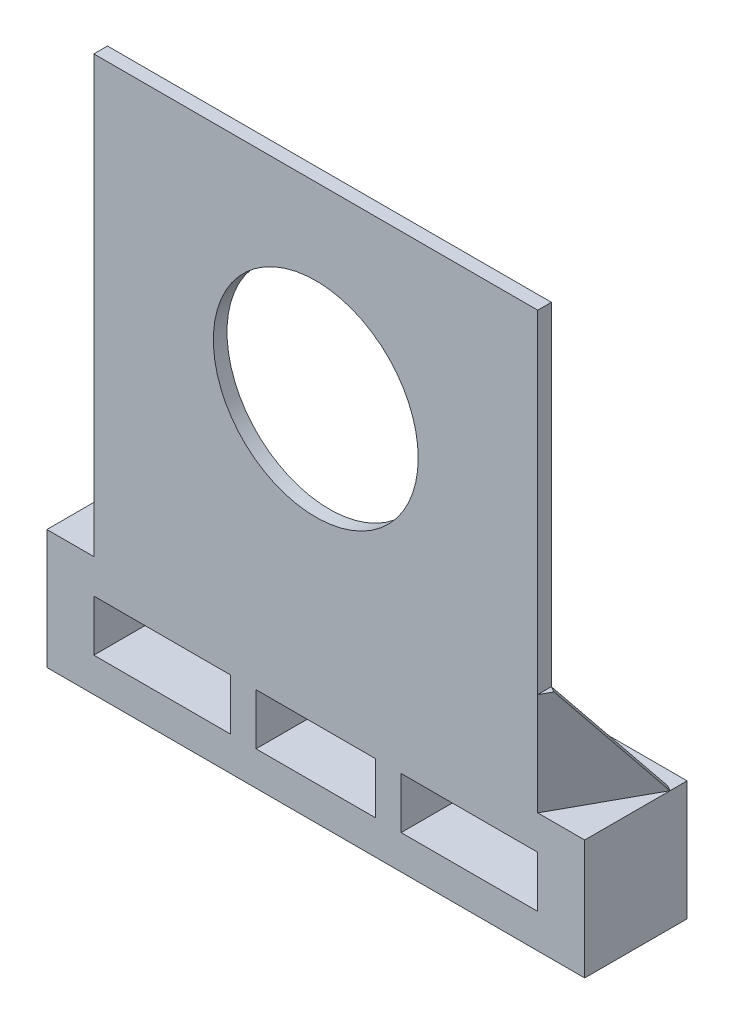
ISO-10303-21;
HEADER;
FILE_DESCRIPTION(('STEP AP214'),'2;1');
FILE_NAME('part.step','',(''),(''),'','','');
FILE_SCHEMA(('AUTOMOTIVE_DESIGN { 1 0 10303 214 1 1 1 1 }'));
ENDSEC;
DATA;
#1=APPLICATION_CONTEXT('core data for automotive mechanical design processes');
#2=APPLICATION_PROTOCOL_DEFINITION('international standard','automotive_design',2000,#1);
#3=PRODUCT_CONTEXT('',#1,'mechanical');
#4=PRODUCT('Part','Part','',(#3));
#5=PRODUCT_RELATED_PRODUCT_CATEGORY('part','',(#4));
#6=PRODUCT_DEFINITION_FORMATION('','',#4);
#7=PRODUCT_DEFINITION_CONTEXT('part definition',#1,'design');
#8=PRODUCT_DEFINITION('design','',#6,#7);
#9=PRODUCT_DEFINITION_SHAPE('','',#8);
#10=(LENGTH_UNIT() NAMED_UNIT(*) SI_UNIT(.MILLI.,.METRE.));
#11=(NAMED_UNIT(*) PLANE_ANGLE_UNIT() SI_UNIT($,.RADIAN.));
#12=(NAMED_UNIT(*) SI_UNIT($,.STERADIAN.) SOLID_ANGLE_UNIT());
#13=UNCERTAINTY_MEASURE_WITH_UNIT(LENGTH_MEASURE(1.E-05),#10,'distance_accuracy_value','');
#14=(GEOMETRIC_REPRESENTATION_CONTEXT(3) GLOBAL_UNCERTAINTY_ASSIGNED_CONTEXT((#13)) GLOBAL_UNIT_ASSIGNED_CONTEXT((#10,
#11,#12)) REPRESENTATION_CONTEXT('',''));
#15=CARTESIAN_POINT('',(0.,0.,0.));
#16=DIRECTION('',(0.,0.,1.));
#17=DIRECTION('',(1.,0.,0.));
#18=AXIS2_PLACEMENT_3D('',#15,#16,#17);
#19=CARTESIAN_POINT('',(-130.,-67.5,-8.));
#20=DIRECTION('',(0.876215908676646,0.,-0.481918749772157));
#21=DIRECTION('',(-0.481918749772158,0.,-0.876215908676646));
#22=AXIS2_PLACEMENT_3D('',#19,#20,#21);
#23=PLANE('',#22);
#24=DIRECTION('',(0.481918749772157,0.,0.876215908676646));
#25=VECTOR('',#24,1.);
#26=CARTESIAN_POINT('',(-130.,-127.5,-8.));
#27=LINE('',#26,#25);
#28=CARTESIAN_POINT('',(-154.121880998081,-127.5,-51.8579654510556));
#29=VERTEX_POINT('',#28);
#30=CARTESIAN_POINT('',(-130.,-127.5,-8.));
#31=VERTEX_POINT('',#30);
#32=EDGE_CURVE('E466',#29,#31,#27,.T.);
#33=ORIENTED_EDGE('',*,*,#32,.F.);
#34=DIRECTION('',(0.308712772093157,0.767882335837045,0.561295949260283));
#35=VECTOR('',#34,1.);
#36=CARTESIAN_POINT('',(-130.,-67.5,-8.));
#37=LINE('',#36,#35);
#38=CARTESIAN_POINT('',(-130.,-67.5,-7.99999999999998));
#39=VERTEX_POINT('',#38);
#40=EDGE_CURVE('E477',#29,#39,#37,.T.);
#41=ORIENTED_EDGE('',*,*,#40,.T.);
#42=DIRECTION('',(0.,-1.,0.));
#43=VECTOR('',#42,1.);
#44=CARTESIAN_POINT('',(-130.,-67.5,-8.));
#45=LINE('',#44,#43);
#46=EDGE_CURVE('E99',#39,#31,#45,.T.);
#47=ORIENTED_EDGE('',*,*,#46,.T.);
#48=EDGE_LOOP('',(#33,#41,#47));
#49=FACE_BOUND('',#48,.T.);
#50=ADVANCED_FACE('F33',(#49),#23,.T.);
#51=CARTESIAN_POINT('',(-130.,-67.5,0.));
#52=DIRECTION('',(-0.876215908676646,0.,0.481918749772157));
#53=DIRECTION('',(0.481918749772157,0.,0.876215908676647));
#54=AXIS2_PLACEMENT_3D('',#51,#52,#53);
#55=PLANE('',#54);
#56=DIRECTION('',(-0.481918749772157,0.,-0.876215908676646));
#57=VECTOR('',#56,1.);
#58=CARTESIAN_POINT('',(-130.,-67.5,0.));
#59=LINE('',#58,#57);
#60=CARTESIAN_POINT('',(-130.,-67.5,0.));
#61=VERTEX_POINT('',#60);
#62=CARTESIAN_POINT('',(-133.378119001919,-67.5,-6.14203454894435));
#63=VERTEX_POINT('',#62);
#64=EDGE_CURVE('E100',#61,#63,#59,.T.);
#65=ORIENTED_EDGE('',*,*,#64,.T.);
#66=DIRECTION('',(-0.308712772093157,-0.767882335837044,-0.561295949260283));
#67=VECTOR('',#66,1.);
#68=CARTESIAN_POINT('',(-133.378119001919,-67.5,-6.14203454894428));
#69=LINE('',#68,#67);
#70=CARTESIAN_POINT('',(-157.5,-127.5,-49.9999999999999));
#71=VERTEX_POINT('',#70);
#72=EDGE_CURVE('E47',#63,#71,#69,.T.);
#73=ORIENTED_EDGE('',*,*,#72,.T.);
#74=DIRECTION('',(-0.481918749772157,0.,-0.876215908676646));
#75=VECTOR('',#74,1.);
#76=CARTESIAN_POINT('',(-130.,-127.5,0.));
#77=LINE('',#76,#75);
#78=CARTESIAN_POINT('',(-130.,-127.5,0.));
#79=VERTEX_POINT('',#78);
#80=EDGE_CURVE('E72',#79,#71,#77,.T.);
#81=ORIENTED_EDGE('',*,*,#80,.F.);
#82=DIRECTION('',(0.,-1.,0.));
#83=VECTOR('',#82,1.);
#84=CARTESIAN_POINT('',(-130.,-67.5,0.));
#85=LINE('',#84,#83);
#86=EDGE_CURVE('E77',#61,#79,#85,.T.);
#87=ORIENTED_EDGE('',*,*,#86,.F.);
#88=EDGE_LOOP('',(#65,#73,#81,#87));
#89=FACE_BOUND('',#88,.T.);
#90=ADVANCED_FACE('F75',(#89),#55,.T.);
#91=CARTESIAN_POINT('',(0.,-67.4999999999999,0.));
#92=DIRECTION('',(0.,-1.,0.));
#93=DIRECTION('',(0.,0.,-1.));
#94=AXIS2_PLACEMENT_3D('',#91,#92,#93);
#95=PLANE('',#94);
#96=DIRECTION('',(0.876215908676646,0.,-0.481918749772157));
#97=VECTOR('',#96,1.);
#98=CARTESIAN_POINT('',(-33.570057581574,-67.4999999999999,-61.0364683301344));
#99=LINE('',#98,#97);
#100=EDGE_CURVE('E11',#63,#39,#99,.T.);
#101=ORIENTED_EDGE('',*,*,#100,.F.);
#102=ORIENTED_EDGE('',*,*,#64,.F.);
#103=DIRECTION('',(0.,0.,1.));
#104=VECTOR('',#103,1.);
#105=CARTESIAN_POINT('',(-130.,-67.5,0.));
#106=LINE('',#105,#104);
#107=EDGE_CURVE('E84',#39,#61,#106,.T.);
#108=ORIENTED_EDGE('',*,*,#107,.F.);
#109=EDGE_LOOP('',(#101,#102,#108));
#110=FACE_BOUND('',#109,.T.);
#111=ADVANCED_FACE('F483',(#110),#95,.F.);
#112=CARTESIAN_POINT('',(-157.5,-127.5,-60.));
#113=DIRECTION('',(0.,1.,0.));
#114=DIRECTION('',(0.,0.,1.));
#115=AXIS2_PLACEMENT_3D('',#112,#113,#114);
#116=PLANE('',#115);
#117=DIRECTION('',(-1.,0.,0.));
#118=VECTOR('',#117,1.);
#119=CARTESIAN_POINT('',(-157.5,-127.5,-60.));
#120=LINE('',#119,#118);
#121=CARTESIAN_POINT('',(157.5,-127.5,-60.));
#122=VERTEX_POINT('',#121);
#123=CARTESIAN_POINT('',(-157.5,-127.5,-60.));
#124=VERTEX_POINT('',#123);
#125=EDGE_CURVE('E336',#122,#124,#120,.T.);
#126=ORIENTED_EDGE('',*,*,#125,.T.);
#127=DIRECTION('',(0.,0.,1.));
#128=VECTOR('',#127,1.);
#129=CARTESIAN_POINT('',(-157.5,-127.5,-60.));
#130=LINE('',#129,#128);
#131=EDGE_CURVE('E126',#124,#71,#130,.T.);
#132=ORIENTED_EDGE('',*,*,#131,.T.);
#133=DIRECTION('',(0.876215908676647,0.,-0.481918749772156));
#134=VECTOR('',#133,1.);
#135=CARTESIAN_POINT('',(-154.121880998081,-127.5,-51.8579654510557));
#136=LINE('',#135,#134);
#137=EDGE_CURVE('E85',#71,#29,#136,.T.);
#138=ORIENTED_EDGE('',*,*,#137,.T.);
#139=ORIENTED_EDGE('',*,*,#32,.T.);
#140=DIRECTION('',(1.,0.,0.));
#141=VECTOR('',#140,1.);
#142=CARTESIAN_POINT('',(-130.,-127.5,-8.));
#143=LINE('',#142,#141);
#144=CARTESIAN_POINT('',(130.,-127.5,-8.));
#145=VERTEX_POINT('',#144);
#146=EDGE_CURVE('E148',#31,#145,#143,.T.);
#147=ORIENTED_EDGE('',*,*,#146,.T.);
#148=DIRECTION('',(-0.481918749772157,0.,0.876215908676646));
#149=VECTOR('',#148,1.);
#150=CARTESIAN_POINT('',(130.,-127.5,-8.));
#151=LINE('',#150,#149);
#152=CARTESIAN_POINT('',(154.121880998081,-127.5,-51.8579654510556));
#153=VERTEX_POINT('',#152);
#154=EDGE_CURVE('E188',#153,#145,#151,.T.);
#155=ORIENTED_EDGE('',*,*,#154,.F.);
#156=DIRECTION('',(-0.876215908676647,0.,-0.481918749772156));
#157=VECTOR('',#156,1.);
#158=CARTESIAN_POINT('',(154.121880998081,-127.5,-51.8579654510557));
#159=LINE('',#158,#157);
#160=CARTESIAN_POINT('',(157.5,-127.5,-49.9999999999999));
#161=VERTEX_POINT('',#160);
#162=EDGE_CURVE('E218',#161,#153,#159,.T.);
#163=ORIENTED_EDGE('',*,*,#162,.F.);
#164=DIRECTION('',(0.,0.,1.));
#165=VECTOR('',#164,1.);
#166=CARTESIAN_POINT('',(157.5,-127.5,-60.));
#167=LINE('',#166,#165);
#168=EDGE_CURVE('E129',#122,#161,#167,.T.);
#169=ORIENTED_EDGE('',*,*,#168,.F.);
#170=EDGE_LOOP('',(#126,#132,#138,#139,#147,#155,#163,#169));
#171=FACE_BOUND('',#170,.T.);
#172=ADVANCED_FACE('F445',(#171),#116,.T.);
#173=CARTESIAN_POINT('',(-130.,127.5,-8.));
#174=DIRECTION('',(-1.,0.,0.));
#175=DIRECTION('',(0.,-1.,0.));
#176=AXIS2_PLACEMENT_3D('',#173,#174,#175);
#177=PLANE('',#176);
#178=DIRECTION('',(0.,-1.,0.));
#179=VECTOR('',#178,1.);
#180=CARTESIAN_POINT('',(-130.,127.5,-8.));
#181=LINE('',#180,#179);
#182=CARTESIAN_POINT('',(-130.,127.5,-8.));
#183=VERTEX_POINT('',#182);
#184=EDGE_CURVE('E146',#183,#39,#181,.T.);
#185=ORIENTED_EDGE('',*,*,#184,.T.);
#186=ORIENTED_EDGE('',*,*,#107,.T.);
#187=DIRECTION('',(0.,-1.,0.));
#188=VECTOR('',#187,1.);
#189=CARTESIAN_POINT('',(-130.,127.5,0.));
#190=LINE('',#189,#188);
#191=CARTESIAN_POINT('',(-130.,127.5,0.));
#192=VERTEX_POINT('',#191);
#193=EDGE_CURVE('E98',#192,#61,#190,.T.);
#194=ORIENTED_EDGE('',*,*,#193,.F.);
#195=DIRECTION('',(0.,0.,1.));
#196=VECTOR('',#195,1.);
#197=CARTESIAN_POINT('',(-130.,127.5,-8.));
#198=LINE('',#197,#196);
#199=EDGE_CURVE('E56',#183,#192,#198,.T.);
#200=ORIENTED_EDGE('',*,*,#199,.F.);
#201=EDGE_LOOP('',(#185,#186,#194,#200));
#202=FACE_BOUND('',#201,.T.);
#203=ADVANCED_FACE('F471',(#202),#177,.T.);
#204=CARTESIAN_POINT('',(130.,127.5,-8.));
#205=DIRECTION('',(1.,0.,0.));
#206=DIRECTION('',(0.,1.,0.));
#207=AXIS2_PLACEMENT_3D('',#204,#205,#206);
#208=PLANE('',#207);
#209=DIRECTION('',(0.,1.,0.));
#210=VECTOR('',#209,1.);
#211=CARTESIAN_POINT('',(130.,127.5,0.));
#212=LINE('',#211,#210);
#213=CARTESIAN_POINT('',(130.,-67.5,0.));
#214=VERTEX_POINT('',#213);
#215=CARTESIAN_POINT('',(130.,127.5,0.));
#216=VERTEX_POINT('',#215);
#217=EDGE_CURVE('E136',#214,#216,#212,.T.);
#218=ORIENTED_EDGE('',*,*,#217,.F.);
#219=DIRECTION('',(0.,0.,1.));
#220=VECTOR('',#219,1.);
#221=CARTESIAN_POINT('',(130.,-67.5,0.));
#222=LINE('',#221,#220);
#223=CARTESIAN_POINT('',(130.,-67.5,-8.));
#224=VERTEX_POINT('',#223);
#225=EDGE_CURVE('E168',#224,#214,#222,.T.);
#226=ORIENTED_EDGE('',*,*,#225,.F.);
#227=DIRECTION('',(0.,1.,0.));
#228=VECTOR('',#227,1.);
#229=CARTESIAN_POINT('',(130.,127.5,-8.));
#230=LINE('',#229,#228);
#231=CARTESIAN_POINT('',(130.,127.5,-8.));
#232=VERTEX_POINT('',#231);
#233=EDGE_CURVE('E143',#224,#232,#230,.T.);
#234=ORIENTED_EDGE('',*,*,#233,.T.);
#235=DIRECTION('',(0.,0.,1.));
#236=VECTOR('',#235,1.);
#237=CARTESIAN_POINT('',(130.,127.5,-8.));
#238=LINE('',#237,#236);
#239=EDGE_CURVE('E151',#232,#216,#238,.T.);
#240=ORIENTED_EDGE('',*,*,#239,.T.);
#241=EDGE_LOOP('',(#218,#226,#234,#240));
#242=FACE_BOUND('',#241,.T.);
#243=ADVANCED_FACE('F35',(#242),#208,.T.);
#244=CARTESIAN_POINT('',(157.5,-127.5,0.));
#245=VERTEX_POINT('',#244);
#246=EDGE_CURVE('E132',#161,#245,#167,.T.);
#247=ORIENTED_EDGE('',*,*,#246,.F.);
#248=DIRECTION('',(0.481918749772157,0.,-0.876215908676646));
#249=VECTOR('',#248,1.);
#250=CARTESIAN_POINT('',(130.,-127.5,0.));
#251=LINE('',#250,#249);
#252=CARTESIAN_POINT('',(130.,-127.5,0.));
#253=VERTEX_POINT('',#252);
#254=EDGE_CURVE('E210',#253,#161,#251,.T.);
#255=ORIENTED_EDGE('',*,*,#254,.F.);
#256=DIRECTION('',(-1.,0.,0.));
#257=VECTOR('',#256,1.);
#258=CARTESIAN_POINT('',(-157.5,-127.5,0.));
#259=LINE('',#258,#257);
#260=EDGE_CURVE('E104',#245,#253,#259,.T.);
#261=ORIENTED_EDGE('',*,*,#260,.F.);
#262=EDGE_LOOP('',(#247,#255,#261));
#263=FACE_BOUND('',#262,.T.);
#264=ADVANCED_FACE('F215',(#263),#116,.T.);
#265=ORIENTED_EDGE('',*,*,#80,.T.);
#266=CARTESIAN_POINT('',(-157.5,-127.5,0.));
#267=VERTEX_POINT('',#266);
#268=EDGE_CURVE('E103',#71,#267,#130,.T.);
#269=ORIENTED_EDGE('',*,*,#268,.T.);
#270=EDGE_CURVE('E95',#79,#267,#259,.T.);
#271=ORIENTED_EDGE('',*,*,#270,.F.);
#272=EDGE_LOOP('',(#265,#269,#271));
#273=FACE_BOUND('',#272,.T.);
#274=ADVANCED_FACE('F102',(#273),#116,.T.);
#275=CARTESIAN_POINT('',(-130.,127.5,-8.));
#276=DIRECTION('',(0.,1.,0.));
#277=DIRECTION('',(0.,0.,1.));
#278=AXIS2_PLACEMENT_3D('',#275,#276,#277);
#279=PLANE('',#278);
#280=DIRECTION('',(-1.,0.,0.));
#281=VECTOR('',#280,1.);
#282=CARTESIAN_POINT('',(-130.,127.5,0.));
#283=LINE('',#282,#281);
#284=EDGE_CURVE('E154',#216,#192,#283,.T.);
#285=ORIENTED_EDGE('',*,*,#284,.F.);
#286=ORIENTED_EDGE('',*,*,#239,.F.);
#287=DIRECTION('',(-1.,0.,0.));
#288=VECTOR('',#287,1.);
#289=CARTESIAN_POINT('',(-130.,127.5,-8.));
#290=LINE('',#289,#288);
#291=EDGE_CURVE('E142',#232,#183,#290,.T.);
#292=ORIENTED_EDGE('',*,*,#291,.T.);
#293=ORIENTED_EDGE('',*,*,#199,.T.);
#294=EDGE_LOOP('',(#285,#286,#292,#293));
#295=FACE_BOUND('',#294,.T.);
#296=ADVANCED_FACE('F200',(#295),#279,.T.);
#297=CARTESIAN_POINT('',(0.,0.,-8.));
#298=DIRECTION('',(0.,0.,1.));
#299=DIRECTION('',(1.,0.,0.));
#300=AXIS2_PLACEMENT_3D('',#297,#298,#299);
#301=PLANE('',#300);
#302=CARTESIAN_POINT('',(0.,17.5,-8.));
#303=DIRECTION('',(0.,0.,1.));
#304=DIRECTION('',(1.,0.,0.));
#305=AXIS2_PLACEMENT_3D('',#302,#303,#304);
#306=CIRCLE('',#305,60.);
#307=CARTESIAN_POINT('',(60.,17.5,-8.));
#308=VERTEX_POINT('',#307);
#309=EDGE_CURVE('E133',#308,#308,#306,.T.);
#310=ORIENTED_EDGE('',*,*,#309,.T.);
#311=EDGE_LOOP('',(#310));
#312=FACE_BOUND('',#311,.T.);
#313=EDGE_CURVE('E139',#145,#224,#230,.T.);
#314=ORIENTED_EDGE('',*,*,#313,.F.);
#315=ORIENTED_EDGE('',*,*,#146,.F.);
#316=ORIENTED_EDGE('',*,*,#46,.F.);
#317=ORIENTED_EDGE('',*,*,#184,.F.);
#318=ORIENTED_EDGE('',*,*,#291,.F.);
#319=ORIENTED_EDGE('',*,*,#233,.F.);
#320=EDGE_LOOP('',(#314,#315,#316,#317,#318,#319));
#321=FACE_BOUND('',#320,.T.);
#322=ADVANCED_FACE('F196',(#312,#321),#301,.F.);
#323=CARTESIAN_POINT('',(0.,0.,0.));
#324=DIRECTION('',(0.,0.,1.));
#325=DIRECTION('',(1.,0.,0.));
#326=AXIS2_PLACEMENT_3D('',#323,#324,#325);
#327=PLANE('',#326);
#328=CARTESIAN_POINT('',(0.,17.5,0.));
#329=DIRECTION('',(0.,0.,1.));
#330=DIRECTION('',(1.,0.,0.));
#331=AXIS2_PLACEMENT_3D('',#328,#329,#330);
#332=CIRCLE('',#331,60.);
#333=CARTESIAN_POINT('',(60.,17.5,0.));
#334=VERTEX_POINT('',#333);
#335=EDGE_CURVE('E122',#334,#334,#332,.T.);
#336=ORIENTED_EDGE('',*,*,#335,.F.);
#337=EDGE_LOOP('',(#336));
#338=FACE_BOUND('',#337,.T.);
#339=EDGE_CURVE('E152',#253,#214,#212,.T.);
#340=ORIENTED_EDGE('',*,*,#339,.T.);
#341=ORIENTED_EDGE('',*,*,#217,.T.);
#342=ORIENTED_EDGE('',*,*,#284,.T.);
#343=ORIENTED_EDGE('',*,*,#193,.T.);
#344=ORIENTED_EDGE('',*,*,#86,.T.);
#345=ORIENTED_EDGE('',*,*,#270,.T.);
#346=DIRECTION('',(0.,-1.,0.));
#347=VECTOR('',#346,1.);
#348=CARTESIAN_POINT('',(-157.5,-127.5,0.));
#349=LINE('',#348,#347);
#350=CARTESIAN_POINT('',(-157.5,-197.5,0.));
#351=VERTEX_POINT('',#350);
#352=EDGE_CURVE('E108',#267,#351,#349,.T.);
#353=ORIENTED_EDGE('',*,*,#352,.T.);
#354=DIRECTION('',(1.,0.,0.));
#355=VECTOR('',#354,1.);
#356=CARTESIAN_POINT('',(-157.5,-197.5,0.));
#357=LINE('',#356,#355);
#358=CARTESIAN_POINT('',(157.5,-197.5,0.));
#359=VERTEX_POINT('',#358);
#360=EDGE_CURVE('E115',#351,#359,#357,.T.);
#361=ORIENTED_EDGE('',*,*,#360,.T.);
#362=DIRECTION('',(0.,1.,0.));
#363=VECTOR('',#362,1.);
#364=CARTESIAN_POINT('',(157.5,-127.5,0.));
#365=LINE('',#364,#363);
#366=EDGE_CURVE('E105',#359,#245,#365,.T.);
#367=ORIENTED_EDGE('',*,*,#366,.T.);
#368=ORIENTED_EDGE('',*,*,#260,.T.);
#369=EDGE_LOOP('',(#340,#341,#342,#343,#344,#345,#353,#361,#367,#368));
#370=FACE_BOUND('',#369,.T.);
#371=DIRECTION('',(0.,1.,0.));
#372=VECTOR('',#371,1.);
#373=CARTESIAN_POINT('',(-50.,-147.5,0.));
#374=LINE('',#373,#372);
#375=CARTESIAN_POINT('',(-50.,-177.5,0.));
#376=VERTEX_POINT('',#375);
#377=CARTESIAN_POINT('',(-50.,-147.5,0.));
#378=VERTEX_POINT('',#377);
#379=EDGE_CURVE('E241',#376,#378,#374,.T.);
#380=ORIENTED_EDGE('',*,*,#379,.F.);
#381=DIRECTION('',(1.,0.,0.));
#382=VECTOR('',#381,1.);
#383=CARTESIAN_POINT('',(-130.,-177.5,0.));
#384=LINE('',#383,#382);
#385=CARTESIAN_POINT('',(-130.,-177.5,0.));
#386=VERTEX_POINT('',#385);
#387=EDGE_CURVE('E231',#386,#376,#384,.T.);
#388=ORIENTED_EDGE('',*,*,#387,.F.);
#389=DIRECTION('',(0.,-1.,0.));
#390=VECTOR('',#389,1.);
#391=CARTESIAN_POINT('',(-130.,-147.5,0.));
#392=LINE('',#391,#390);
#393=CARTESIAN_POINT('',(-130.,-147.5,0.));
#394=VERTEX_POINT('',#393);
#395=EDGE_CURVE('E247',#394,#386,#392,.T.);
#396=ORIENTED_EDGE('',*,*,#395,.F.);
#397=DIRECTION('',(-1.,0.,0.));
#398=VECTOR('',#397,1.);
#399=CARTESIAN_POINT('',(-130.,-147.5,0.));
#400=LINE('',#399,#398);
#401=EDGE_CURVE('E244',#378,#394,#400,.T.);
#402=ORIENTED_EDGE('',*,*,#401,.F.);
#403=EDGE_LOOP('',(#380,#388,#396,#402));
#404=FACE_BOUND('',#403,.T.);
#405=DIRECTION('',(0.,1.,0.));
#406=VECTOR('',#405,1.);
#407=CARTESIAN_POINT('',(130.,-147.5,0.));
#408=LINE('',#407,#406);
#409=CARTESIAN_POINT('',(130.,-177.5,0.));
#410=VERTEX_POINT('',#409);
#411=CARTESIAN_POINT('',(130.,-147.5,0.));
#412=VERTEX_POINT('',#411);
#413=EDGE_CURVE('E255',#410,#412,#408,.T.);
#414=ORIENTED_EDGE('',*,*,#413,.F.);
#415=DIRECTION('',(1.,0.,0.));
#416=VECTOR('',#415,1.);
#417=CARTESIAN_POINT('',(50.,-177.5,0.));
#418=LINE('',#417,#416);
#419=CARTESIAN_POINT('',(50.,-177.5,0.));
#420=VERTEX_POINT('',#419);
#421=EDGE_CURVE('E268',#420,#410,#418,.T.);
#422=ORIENTED_EDGE('',*,*,#421,.F.);
#423=DIRECTION('',(0.,-1.,0.));
#424=VECTOR('',#423,1.);
#425=CARTESIAN_POINT('',(50.,-147.5,0.));
#426=LINE('',#425,#424);
#427=CARTESIAN_POINT('',(50.,-147.5,0.));
#428=VERTEX_POINT('',#427);
#429=EDGE_CURVE('E283',#428,#420,#426,.T.);
#430=ORIENTED_EDGE('',*,*,#429,.F.);
#431=DIRECTION('',(-1.,0.,0.));
#432=VECTOR('',#431,1.);
#433=CARTESIAN_POINT('',(50.,-147.5,0.));
#434=LINE('',#433,#432);
#435=EDGE_CURVE('E280',#412,#428,#434,.T.);
#436=ORIENTED_EDGE('',*,*,#435,.F.);
#437=EDGE_LOOP('',(#414,#422,#430,#436));
#438=FACE_BOUND('',#437,.T.);
#439=DIRECTION('',(0.,1.,0.));
#440=VECTOR('',#439,1.);
#441=CARTESIAN_POINT('',(35.,-147.5,0.));
#442=LINE('',#441,#440);
#443=CARTESIAN_POINT('',(35.,-177.5,0.));
#444=VERTEX_POINT('',#443);
#445=CARTESIAN_POINT('',(35.,-147.5,0.));
#446=VERTEX_POINT('',#445);
#447=EDGE_CURVE('E291',#444,#446,#442,.T.);
#448=ORIENTED_EDGE('',*,*,#447,.F.);
#449=DIRECTION('',(1.,0.,0.));
#450=VECTOR('',#449,1.);
#451=CARTESIAN_POINT('',(-35.,-177.5,0.));
#452=LINE('',#451,#450);
#453=CARTESIAN_POINT('',(-35.,-177.5,0.));
#454=VERTEX_POINT('',#453);
#455=EDGE_CURVE('E304',#454,#444,#452,.T.);
#456=ORIENTED_EDGE('',*,*,#455,.F.);
#457=DIRECTION('',(0.,-1.,0.));
#458=VECTOR('',#457,1.);
#459=CARTESIAN_POINT('',(-35.,-147.5,0.));
#460=LINE('',#459,#458);
#461=CARTESIAN_POINT('',(-35.,-147.5,0.));
#462=VERTEX_POINT('',#461);
#463=EDGE_CURVE('E319',#462,#454,#460,.T.);
#464=ORIENTED_EDGE('',*,*,#463,.F.);
#465=DIRECTION('',(-1.,0.,0.));
#466=VECTOR('',#465,1.);
#467=CARTESIAN_POINT('',(-35.,-147.5,0.));
#468=LINE('',#467,#466);
#469=EDGE_CURVE('E316',#446,#462,#468,.T.);
#470=ORIENTED_EDGE('',*,*,#469,.F.);
#471=EDGE_LOOP('',(#448,#456,#464,#470));
#472=FACE_BOUND('',#471,.T.);
#473=ADVANCED_FACE('F91',(#338,#370,#404,#438,#472),#327,.T.);
#474=CARTESIAN_POINT('',(0.,17.5,-8.));
#475=DIRECTION('',(0.,0.,1.));
#476=DIRECTION('',(1.,0.,0.));
#477=AXIS2_PLACEMENT_3D('',#474,#475,#476);
#478=CYLINDRICAL_SURFACE('',#477,60.);
#479=ORIENTED_EDGE('',*,*,#309,.F.);
#480=EDGE_LOOP('',(#479));
#481=FACE_BOUND('',#480,.T.);
#482=ORIENTED_EDGE('',*,*,#335,.T.);
#483=EDGE_LOOP('',(#482));
#484=FACE_BOUND('',#483,.T.);
#485=ADVANCED_FACE('F557',(#481,#484),#478,.F.);
#486=CARTESIAN_POINT('',(157.5,-127.5,-60.));
#487=DIRECTION('',(1.,0.,0.));
#488=DIRECTION('',(0.,0.,-1.));
#489=AXIS2_PLACEMENT_3D('',#486,#487,#488);
#490=PLANE('',#489);
#491=ORIENTED_EDGE('',*,*,#366,.F.);
#492=DIRECTION('',(0.,0.,1.));
#493=VECTOR('',#492,1.);
#494=CARTESIAN_POINT('',(157.5,-197.5,-60.));
#495=LINE('',#494,#493);
#496=CARTESIAN_POINT('',(157.5,-197.5,-60.));
#497=VERTEX_POINT('',#496);
#498=EDGE_CURVE('E119',#497,#359,#495,.T.);
#499=ORIENTED_EDGE('',*,*,#498,.F.);
#500=DIRECTION('',(0.,1.,0.));
#501=VECTOR('',#500,1.);
#502=CARTESIAN_POINT('',(157.5,-127.5,-60.));
#503=LINE('',#502,#501);
#504=EDGE_CURVE('E118',#497,#122,#503,.T.);
#505=ORIENTED_EDGE('',*,*,#504,.T.);
#506=ORIENTED_EDGE('',*,*,#168,.T.);
#507=ORIENTED_EDGE('',*,*,#246,.T.);
#508=EDGE_LOOP('',(#491,#499,#505,#506,#507));
#509=FACE_BOUND('',#508,.T.);
#510=ADVANCED_FACE('F349',(#509),#490,.T.);
#511=CARTESIAN_POINT('',(-157.5,-197.5,-60.));
#512=DIRECTION('',(0.,-1.,0.));
#513=DIRECTION('',(0.,0.,-1.));
#514=AXIS2_PLACEMENT_3D('',#511,#512,#513);
#515=PLANE('',#514);
#516=ORIENTED_EDGE('',*,*,#360,.F.);
#517=DIRECTION('',(0.,0.,1.));
#518=VECTOR('',#517,1.);
#519=CARTESIAN_POINT('',(-157.5,-197.5,-60.));
#520=LINE('',#519,#518);
#521=CARTESIAN_POINT('',(-157.5,-197.5,-60.));
#522=VERTEX_POINT('',#521);
#523=EDGE_CURVE('E123',#522,#351,#520,.T.);
#524=ORIENTED_EDGE('',*,*,#523,.F.);
#525=DIRECTION('',(1.,0.,0.));
#526=VECTOR('',#525,1.);
#527=CARTESIAN_POINT('',(-157.5,-197.5,-60.));
#528=LINE('',#527,#526);
#529=EDGE_CURVE('E341',#522,#497,#528,.T.);
#530=ORIENTED_EDGE('',*,*,#529,.T.);
#531=ORIENTED_EDGE('',*,*,#498,.T.);
#532=EDGE_LOOP('',(#516,#524,#530,#531));
#533=FACE_BOUND('',#532,.T.);
#534=ADVANCED_FACE('F549',(#533),#515,.T.);
#535=CARTESIAN_POINT('',(-157.5,-127.5,-60.));
#536=DIRECTION('',(-1.,0.,0.));
#537=DIRECTION('',(0.,0.,1.));
#538=AXIS2_PLACEMENT_3D('',#535,#536,#537);
#539=PLANE('',#538);
#540=ORIENTED_EDGE('',*,*,#352,.F.);
#541=ORIENTED_EDGE('',*,*,#268,.F.);
#542=ORIENTED_EDGE('',*,*,#131,.F.);
#543=DIRECTION('',(0.,-1.,0.));
#544=VECTOR('',#543,1.);
#545=CARTESIAN_POINT('',(-157.5,-127.5,-60.));
#546=LINE('',#545,#544);
#547=EDGE_CURVE('E339',#124,#522,#546,.T.);
#548=ORIENTED_EDGE('',*,*,#547,.T.);
#549=ORIENTED_EDGE('',*,*,#523,.T.);
#550=EDGE_LOOP('',(#540,#541,#542,#548,#549));
#551=FACE_BOUND('',#550,.T.);
#552=ADVANCED_FACE('F448',(#551),#539,.T.);
#553=CARTESIAN_POINT('',(0.,0.,-60.));
#554=DIRECTION('',(0.,0.,1.));
#555=DIRECTION('',(1.,0.,0.));
#556=AXIS2_PLACEMENT_3D('',#553,#554,#555);
#557=PLANE('',#556);
#558=DIRECTION('',(1.,0.,0.));
#559=VECTOR('',#558,1.);
#560=CARTESIAN_POINT('',(-130.,-177.5,-60.));
#561=LINE('',#560,#559);
#562=CARTESIAN_POINT('',(-130.,-177.5,-60.));
#563=VERTEX_POINT('',#562);
#564=CARTESIAN_POINT('',(-50.,-177.5,-60.));
#565=VERTEX_POINT('',#564);
#566=EDGE_CURVE('E237',#563,#565,#561,.T.);
#567=ORIENTED_EDGE('',*,*,#566,.T.);
#568=DIRECTION('',(0.,1.,0.));
#569=VECTOR('',#568,1.);
#570=CARTESIAN_POINT('',(-50.,-147.5,-60.));
#571=LINE('',#570,#569);
#572=CARTESIAN_POINT('',(-50.,-147.5,-60.));
#573=VERTEX_POINT('',#572);
#574=EDGE_CURVE('E227',#565,#573,#571,.T.);
#575=ORIENTED_EDGE('',*,*,#574,.T.);
#576=DIRECTION('',(-1.,0.,0.));
#577=VECTOR('',#576,1.);
#578=CARTESIAN_POINT('',(-130.,-147.5,-60.));
#579=LINE('',#578,#577);
#580=CARTESIAN_POINT('',(-130.,-147.5,-60.));
#581=VERTEX_POINT('',#580);
#582=EDGE_CURVE('E230',#573,#581,#579,.T.);
#583=ORIENTED_EDGE('',*,*,#582,.T.);
#584=DIRECTION('',(0.,-1.,0.));
#585=VECTOR('',#584,1.);
#586=CARTESIAN_POINT('',(-130.,-147.5,-60.));
#587=LINE('',#586,#585);
#588=EDGE_CURVE('E234',#581,#563,#587,.T.);
#589=ORIENTED_EDGE('',*,*,#588,.T.);
#590=EDGE_LOOP('',(#567,#575,#583,#589));
#591=FACE_BOUND('',#590,.T.);
#592=DIRECTION('',(1.,0.,0.));
#593=VECTOR('',#592,1.);
#594=CARTESIAN_POINT('',(50.,-177.5,-60.));
#595=LINE('',#594,#593);
#596=CARTESIAN_POINT('',(50.,-177.5,-60.));
#597=VERTEX_POINT('',#596);
#598=CARTESIAN_POINT('',(130.,-177.5,-60.));
#599=VERTEX_POINT('',#598);
#600=EDGE_CURVE('E274',#597,#599,#595,.T.);
#601=ORIENTED_EDGE('',*,*,#600,.T.);
#602=DIRECTION('',(0.,1.,0.));
#603=VECTOR('',#602,1.);
#604=CARTESIAN_POINT('',(130.,-147.5,-60.));
#605=LINE('',#604,#603);
#606=CARTESIAN_POINT('',(130.,-147.5,-60.));
#607=VERTEX_POINT('',#606);
#608=EDGE_CURVE('E264',#599,#607,#605,.T.);
#609=ORIENTED_EDGE('',*,*,#608,.T.);
#610=DIRECTION('',(-1.,0.,0.));
#611=VECTOR('',#610,1.);
#612=CARTESIAN_POINT('',(50.,-147.5,-60.));
#613=LINE('',#612,#611);
#614=CARTESIAN_POINT('',(50.,-147.5,-60.));
#615=VERTEX_POINT('',#614);
#616=EDGE_CURVE('E267',#607,#615,#613,.T.);
#617=ORIENTED_EDGE('',*,*,#616,.T.);
#618=DIRECTION('',(0.,-1.,0.));
#619=VECTOR('',#618,1.);
#620=CARTESIAN_POINT('',(50.,-147.5,-60.));
#621=LINE('',#620,#619);
#622=EDGE_CURVE('E271',#615,#597,#621,.T.);
#623=ORIENTED_EDGE('',*,*,#622,.T.);
#624=EDGE_LOOP('',(#601,#609,#617,#623));
#625=FACE_BOUND('',#624,.T.);
#626=DIRECTION('',(1.,0.,0.));
#627=VECTOR('',#626,1.);
#628=CARTESIAN_POINT('',(-35.,-177.5,-60.));
#629=LINE('',#628,#627);
#630=CARTESIAN_POINT('',(-35.,-177.5,-60.));
#631=VERTEX_POINT('',#630);
#632=CARTESIAN_POINT('',(35.,-177.5,-60.));
#633=VERTEX_POINT('',#632);
#634=EDGE_CURVE('E310',#631,#633,#629,.T.);
#635=ORIENTED_EDGE('',*,*,#634,.T.);
#636=DIRECTION('',(0.,1.,0.));
#637=VECTOR('',#636,1.);
#638=CARTESIAN_POINT('',(35.,-147.5,-60.));
#639=LINE('',#638,#637);
#640=CARTESIAN_POINT('',(35.,-147.5,-60.));
#641=VERTEX_POINT('',#640);
#642=EDGE_CURVE('E300',#633,#641,#639,.T.);
#643=ORIENTED_EDGE('',*,*,#642,.T.);
#644=DIRECTION('',(-1.,0.,0.));
#645=VECTOR('',#644,1.);
#646=CARTESIAN_POINT('',(-35.,-147.5,-60.));
#647=LINE('',#646,#645);
#648=CARTESIAN_POINT('',(-35.,-147.5,-60.));
#649=VERTEX_POINT('',#648);
#650=EDGE_CURVE('E303',#641,#649,#647,.T.);
#651=ORIENTED_EDGE('',*,*,#650,.T.);
#652=DIRECTION('',(0.,-1.,0.));
#653=VECTOR('',#652,1.);
#654=CARTESIAN_POINT('',(-35.,-147.5,-60.));
#655=LINE('',#654,#653);
#656=EDGE_CURVE('E307',#649,#631,#655,.T.);
#657=ORIENTED_EDGE('',*,*,#656,.T.);
#658=EDGE_LOOP('',(#635,#643,#651,#657));
#659=FACE_BOUND('',#658,.T.);
#660=ORIENTED_EDGE('',*,*,#504,.F.);
#661=ORIENTED_EDGE('',*,*,#529,.F.);
#662=ORIENTED_EDGE('',*,*,#547,.F.);
#663=ORIENTED_EDGE('',*,*,#125,.F.);
#664=EDGE_LOOP('',(#660,#661,#662,#663));
#665=FACE_BOUND('',#664,.T.);
#666=ADVANCED_FACE('F391',(#591,#625,#659,#665),#557,.F.);
#667=CARTESIAN_POINT('',(35.,-147.5,-60.));
#668=DIRECTION('',(1.,0.,0.));
#669=DIRECTION('',(0.,0.,-1.));
#670=AXIS2_PLACEMENT_3D('',#667,#668,#669);
#671=PLANE('',#670);
#672=ORIENTED_EDGE('',*,*,#447,.T.);
#673=DIRECTION('',(0.,0.,1.));
#674=VECTOR('',#673,1.);
#675=CARTESIAN_POINT('',(35.,-147.5,-60.));
#676=LINE('',#675,#674);
#677=EDGE_CURVE('E313',#641,#446,#676,.T.);
#678=ORIENTED_EDGE('',*,*,#677,.F.);
#679=ORIENTED_EDGE('',*,*,#642,.F.);
#680=DIRECTION('',(0.,0.,1.));
#681=VECTOR('',#680,1.);
#682=CARTESIAN_POINT('',(35.,-177.5,-60.));
#683=LINE('',#682,#681);
#684=EDGE_CURVE('E110',#633,#444,#683,.T.);
#685=ORIENTED_EDGE('',*,*,#684,.T.);
#686=EDGE_LOOP('',(#672,#678,#679,#685));
#687=FACE_BOUND('',#686,.T.);
#688=ADVANCED_FACE('F536',(#687),#671,.F.);
#689=CARTESIAN_POINT('',(-35.,-177.5,-60.));
#690=DIRECTION('',(0.,-1.,0.));
#691=DIRECTION('',(0.,0.,-1.));
#692=AXIS2_PLACEMENT_3D('',#689,#690,#691);
#693=PLANE('',#692);
#694=ORIENTED_EDGE('',*,*,#455,.T.);
#695=ORIENTED_EDGE('',*,*,#684,.F.);
#696=ORIENTED_EDGE('',*,*,#634,.F.);
#697=DIRECTION('',(0.,0.,1.));
#698=VECTOR('',#697,1.);
#699=CARTESIAN_POINT('',(-35.,-177.5,-60.));
#700=LINE('',#699,#698);
#701=EDGE_CURVE('E326',#631,#454,#700,.T.);
#702=ORIENTED_EDGE('',*,*,#701,.T.);
#703=EDGE_LOOP('',(#694,#695,#696,#702));
#704=FACE_BOUND('',#703,.T.);
#705=ADVANCED_FACE('F532',(#704),#693,.F.);
#706=CARTESIAN_POINT('',(-35.,-147.5,-60.));
#707=DIRECTION('',(-1.,0.,0.));
#708=DIRECTION('',(0.,0.,1.));
#709=AXIS2_PLACEMENT_3D('',#706,#707,#708);
#710=PLANE('',#709);
#711=ORIENTED_EDGE('',*,*,#463,.T.);
#712=ORIENTED_EDGE('',*,*,#701,.F.);
#713=ORIENTED_EDGE('',*,*,#656,.F.);
#714=DIRECTION('',(0.,0.,1.));
#715=VECTOR('',#714,1.);
#716=CARTESIAN_POINT('',(-35.,-147.5,-60.));
#717=LINE('',#716,#715);
#718=EDGE_CURVE('E329',#649,#462,#717,.T.);
#719=ORIENTED_EDGE('',*,*,#718,.T.);
#720=EDGE_LOOP('',(#711,#712,#713,#719));
#721=FACE_BOUND('',#720,.T.);
#722=ADVANCED_FACE('F535',(#721),#710,.F.);
#723=CARTESIAN_POINT('',(-35.,-147.5,-60.));
#724=DIRECTION('',(0.,1.,0.));
#725=DIRECTION('',(0.,0.,1.));
#726=AXIS2_PLACEMENT_3D('',#723,#724,#725);
#727=PLANE('',#726);
#728=ORIENTED_EDGE('',*,*,#469,.T.);
#729=ORIENTED_EDGE('',*,*,#718,.F.);
#730=ORIENTED_EDGE('',*,*,#650,.F.);
#731=ORIENTED_EDGE('',*,*,#677,.T.);
#732=EDGE_LOOP('',(#728,#729,#730,#731));
#733=FACE_BOUND('',#732,.T.);
#734=ADVANCED_FACE('F530',(#733),#727,.F.);
#735=CARTESIAN_POINT('',(130.,-147.5,-60.));
#736=DIRECTION('',(1.,0.,0.));
#737=DIRECTION('',(0.,0.,-1.));
#738=AXIS2_PLACEMENT_3D('',#735,#736,#737);
#739=PLANE('',#738);
#740=ORIENTED_EDGE('',*,*,#413,.T.);
#741=DIRECTION('',(0.,0.,1.));
#742=VECTOR('',#741,1.);
#743=CARTESIAN_POINT('',(130.,-147.5,-60.));
#744=LINE('',#743,#742);
#745=EDGE_CURVE('E277',#607,#412,#744,.T.);
#746=ORIENTED_EDGE('',*,*,#745,.F.);
#747=ORIENTED_EDGE('',*,*,#608,.F.);
#748=DIRECTION('',(0.,0.,1.));
#749=VECTOR('',#748,1.);
#750=CARTESIAN_POINT('',(130.,-177.5,-60.));
#751=LINE('',#750,#749);
#752=EDGE_CURVE('E288',#599,#410,#751,.T.);
#753=ORIENTED_EDGE('',*,*,#752,.T.);
#754=EDGE_LOOP('',(#740,#746,#747,#753));
#755=FACE_BOUND('',#754,.T.);
#756=ADVANCED_FACE('F520',(#755),#739,.F.);
#757=CARTESIAN_POINT('',(50.,-177.5,-60.));
#758=DIRECTION('',(0.,-1.,0.));
#759=DIRECTION('',(0.,0.,-1.));
#760=AXIS2_PLACEMENT_3D('',#757,#758,#759);
#761=PLANE('',#760);
#762=ORIENTED_EDGE('',*,*,#421,.T.);
#763=ORIENTED_EDGE('',*,*,#752,.F.);
#764=ORIENTED_EDGE('',*,*,#600,.F.);
#765=DIRECTION('',(0.,0.,1.));
#766=VECTOR('',#765,1.);
#767=CARTESIAN_POINT('',(50.,-177.5,-60.));
#768=LINE('',#767,#766);
#769=EDGE_CURVE('E292',#597,#420,#768,.T.);
#770=ORIENTED_EDGE('',*,*,#769,.T.);
#771=EDGE_LOOP('',(#762,#763,#764,#770));
#772=FACE_BOUND('',#771,.T.);
#773=ADVANCED_FACE('F516',(#772),#761,.F.);
#774=CARTESIAN_POINT('',(50.,-147.5,-60.));
#775=DIRECTION('',(-1.,0.,0.));
#776=DIRECTION('',(0.,0.,1.));
#777=AXIS2_PLACEMENT_3D('',#774,#775,#776);
#778=PLANE('',#777);
#779=ORIENTED_EDGE('',*,*,#429,.T.);
#780=ORIENTED_EDGE('',*,*,#769,.F.);
#781=ORIENTED_EDGE('',*,*,#622,.F.);
#782=DIRECTION('',(0.,0.,1.));
#783=VECTOR('',#782,1.);
#784=CARTESIAN_POINT('',(50.,-147.5,-60.));
#785=LINE('',#784,#783);
#786=EDGE_CURVE('E295',#615,#428,#785,.T.);
#787=ORIENTED_EDGE('',*,*,#786,.T.);
#788=EDGE_LOOP('',(#779,#780,#781,#787));
#789=FACE_BOUND('',#788,.T.);
#790=ADVANCED_FACE('F519',(#789),#778,.F.);
#791=CARTESIAN_POINT('',(50.,-147.5,-60.));
#792=DIRECTION('',(0.,1.,0.));
#793=DIRECTION('',(0.,0.,1.));
#794=AXIS2_PLACEMENT_3D('',#791,#792,#793);
#795=PLANE('',#794);
#796=ORIENTED_EDGE('',*,*,#435,.T.);
#797=ORIENTED_EDGE('',*,*,#786,.F.);
#798=ORIENTED_EDGE('',*,*,#616,.F.);
#799=ORIENTED_EDGE('',*,*,#745,.T.);
#800=EDGE_LOOP('',(#796,#797,#798,#799));
#801=FACE_BOUND('',#800,.T.);
#802=ADVANCED_FACE('F515',(#801),#795,.F.);
#803=CARTESIAN_POINT('',(-50.,-147.5,-60.));
#804=DIRECTION('',(1.,0.,0.));
#805=DIRECTION('',(0.,1.,0.));
#806=AXIS2_PLACEMENT_3D('',#803,#804,#805);
#807=PLANE('',#806);
#808=ORIENTED_EDGE('',*,*,#379,.T.);
#809=DIRECTION('',(0.,0.,1.));
#810=VECTOR('',#809,1.);
#811=CARTESIAN_POINT('',(-50.,-147.5,-60.));
#812=LINE('',#811,#810);
#813=EDGE_CURVE('E240',#573,#378,#812,.T.);
#814=ORIENTED_EDGE('',*,*,#813,.F.);
#815=ORIENTED_EDGE('',*,*,#574,.F.);
#816=DIRECTION('',(0.,0.,1.));
#817=VECTOR('',#816,1.);
#818=CARTESIAN_POINT('',(-50.,-177.5,-60.));
#819=LINE('',#818,#817);
#820=EDGE_CURVE('E252',#565,#376,#819,.T.);
#821=ORIENTED_EDGE('',*,*,#820,.T.);
#822=EDGE_LOOP('',(#808,#814,#815,#821));
#823=FACE_BOUND('',#822,.T.);
#824=ADVANCED_FACE('F399',(#823),#807,.F.);
#825=CARTESIAN_POINT('',(-130.,-177.5,-60.));
#826=DIRECTION('',(0.,-1.,0.));
#827=DIRECTION('',(0.,0.,-1.));
#828=AXIS2_PLACEMENT_3D('',#825,#826,#827);
#829=PLANE('',#828);
#830=ORIENTED_EDGE('',*,*,#387,.T.);
#831=ORIENTED_EDGE('',*,*,#820,.F.);
#832=ORIENTED_EDGE('',*,*,#566,.F.);
#833=DIRECTION('',(0.,0.,1.));
#834=VECTOR('',#833,1.);
#835=CARTESIAN_POINT('',(-130.,-177.5,-60.));
#836=LINE('',#835,#834);
#837=EDGE_CURVE('E256',#563,#386,#836,.T.);
#838=ORIENTED_EDGE('',*,*,#837,.T.);
#839=EDGE_LOOP('',(#830,#831,#832,#838));
#840=FACE_BOUND('',#839,.T.);
#841=ADVANCED_FACE('F506',(#840),#829,.F.);
#842=CARTESIAN_POINT('',(-130.,-147.5,-60.));
#843=DIRECTION('',(-1.,0.,0.));
#844=DIRECTION('',(0.,0.,1.));
#845=AXIS2_PLACEMENT_3D('',#842,#843,#844);
#846=PLANE('',#845);
#847=ORIENTED_EDGE('',*,*,#395,.T.);
#848=ORIENTED_EDGE('',*,*,#837,.F.);
#849=ORIENTED_EDGE('',*,*,#588,.F.);
#850=DIRECTION('',(0.,0.,1.));
#851=VECTOR('',#850,1.);
#852=CARTESIAN_POINT('',(-130.,-147.5,-60.));
#853=LINE('',#852,#851);
#854=EDGE_CURVE('E259',#581,#394,#853,.T.);
#855=ORIENTED_EDGE('',*,*,#854,.T.);
#856=EDGE_LOOP('',(#847,#848,#849,#855));
#857=FACE_BOUND('',#856,.T.);
#858=ADVANCED_FACE('F381',(#857),#846,.F.);
#859=CARTESIAN_POINT('',(-130.,-147.5,-60.));
#860=DIRECTION('',(0.,1.,0.));
#861=DIRECTION('',(0.,0.,1.));
#862=AXIS2_PLACEMENT_3D('',#859,#860,#861);
#863=PLANE('',#862);
#864=ORIENTED_EDGE('',*,*,#401,.T.);
#865=ORIENTED_EDGE('',*,*,#854,.F.);
#866=ORIENTED_EDGE('',*,*,#582,.F.);
#867=ORIENTED_EDGE('',*,*,#813,.T.);
#868=EDGE_LOOP('',(#864,#865,#866,#867));
#869=FACE_BOUND('',#868,.T.);
#870=ADVANCED_FACE('F387',(#869),#863,.F.);
#871=CARTESIAN_POINT('',(130.,-67.5,0.));
#872=DIRECTION('',(-0.876215908676646,0.,-0.481918749772157));
#873=DIRECTION('',(-0.481918749772157,0.,0.876215908676647));
#874=AXIS2_PLACEMENT_3D('',#871,#872,#873);
#875=PLANE('',#874);
#876=ORIENTED_EDGE('',*,*,#254,.T.);
#877=DIRECTION('',(0.308712772093157,-0.767882335837044,-0.561295949260283));
#878=VECTOR('',#877,1.);
#879=CARTESIAN_POINT('',(133.378119001919,-67.5,-6.14203454894428));
#880=LINE('',#879,#878);
#881=CARTESIAN_POINT('',(133.378119001919,-67.5,-6.14203454894428));
#882=VERTEX_POINT('',#881);
#883=EDGE_CURVE('E222',#882,#161,#880,.T.);
#884=ORIENTED_EDGE('',*,*,#883,.F.);
#885=DIRECTION('',(0.481918749772157,0.,-0.876215908676646));
#886=VECTOR('',#885,1.);
#887=CARTESIAN_POINT('',(130.,-67.5,0.));
#888=LINE('',#887,#886);
#889=EDGE_CURVE('E172',#214,#882,#888,.T.);
#890=ORIENTED_EDGE('',*,*,#889,.F.);
#891=ORIENTED_EDGE('',*,*,#339,.F.);
#892=EDGE_LOOP('',(#876,#884,#890,#891));
#893=FACE_BOUND('',#892,.T.);
#894=ADVANCED_FACE('F208',(#893),#875,.F.);
#895=CARTESIAN_POINT('',(130.,-67.5,-8.));
#896=DIRECTION('',(0.876215908676646,0.,0.481918749772157));
#897=DIRECTION('',(0.481918749772158,0.,-0.876215908676646));
#898=AXIS2_PLACEMENT_3D('',#895,#896,#897);
#899=PLANE('',#898);
#900=ORIENTED_EDGE('',*,*,#313,.T.);
#901=DIRECTION('',(0.308712772093157,-0.767882335837045,-0.561295949260283));
#902=VECTOR('',#901,1.);
#903=CARTESIAN_POINT('',(130.,-67.5,-8.));
#904=LINE('',#903,#902);
#905=EDGE_CURVE('E185',#224,#153,#904,.T.);
#906=ORIENTED_EDGE('',*,*,#905,.T.);
#907=ORIENTED_EDGE('',*,*,#154,.T.);
#908=EDGE_LOOP('',(#900,#906,#907));
#909=FACE_BOUND('',#908,.T.);
#910=ADVANCED_FACE('F183',(#909),#899,.F.);
#911=CARTESIAN_POINT('',(0.,-67.4999999999999,0.));
#912=DIRECTION('',(0.,-1.,0.));
#913=DIRECTION('',(0.,0.,-1.));
#914=AXIS2_PLACEMENT_3D('',#911,#912,#913);
#915=PLANE('',#914);
#916=ORIENTED_EDGE('',*,*,#889,.T.);
#917=DIRECTION('',(-0.876215908676646,0.,-0.481918749772157));
#918=VECTOR('',#917,1.);
#919=CARTESIAN_POINT('',(33.570057581574,-67.4999999999999,-61.0364683301344));
#920=LINE('',#919,#918);
#921=EDGE_CURVE('E41',#882,#224,#920,.T.);
#922=ORIENTED_EDGE('',*,*,#921,.T.);
#923=ORIENTED_EDGE('',*,*,#225,.T.);
#924=EDGE_LOOP('',(#916,#922,#923));
#925=FACE_BOUND('',#924,.T.);
#926=ADVANCED_FACE('F165',(#925),#915,.F.);
#927=CARTESIAN_POINT('',(-112.687140115163,-67.5,-141.47792706334));
#928=DIRECTION('',(-0.370056895258712,-0.640590913383451,0.672830718652202));
#929=DIRECTION('',(0.,-0.724245568700914,-0.689542135200663));
#930=AXIS2_PLACEMENT_3D('',#927,#928,#929);
#931=PLANE('',#930);
#932=ORIENTED_EDGE('',*,*,#921,.F.);
#933=ORIENTED_EDGE('',*,*,#883,.T.);
#934=ORIENTED_EDGE('',*,*,#162,.T.);
#935=ORIENTED_EDGE('',*,*,#905,.F.);
#936=EDGE_LOOP('',(#932,#933,#934,#935));
#937=FACE_BOUND('',#936,.T.);
#938=ADVANCED_FACE('F463',(#937),#931,.F.);
#939=CARTESIAN_POINT('',(112.687140115163,-67.5,-141.47792706334));
#940=DIRECTION('',(-0.370056895258712,0.640590913383451,-0.672830718652202));
#941=DIRECTION('',(0.,0.724245568700914,0.689542135200663));
#942=AXIS2_PLACEMENT_3D('',#939,#940,#941);
#943=PLANE('',#942);
#944=ORIENTED_EDGE('',*,*,#137,.F.);
#945=ORIENTED_EDGE('',*,*,#72,.F.);
#946=ORIENTED_EDGE('',*,*,#100,.T.);
#947=ORIENTED_EDGE('',*,*,#40,.F.);
#948=EDGE_LOOP('',(#944,#945,#946,#947));
#949=FACE_BOUND('',#948,.T.);
#950=ADVANCED_FACE('F482',(#949),#943,.T.);
#951=CLOSED_SHELL('',(#50,#90,#111,#172,#203,#243,#264,#274,#296,#322,#473,#485,#510,#534,#552,
#666,#688,#705,#722,#734,#756,#773,#790,#802,#824,#841,#858,#870,#894,#910,#926,#938,#950));
#952=MANIFOLD_SOLID_BREP('B2',#951);
#953=ADVANCED_BREP_SHAPE_REPRESENTATION('',(#18,#952),#14);
#954=SHAPE_DEFINITION_REPRESENTATION(#9,#953);
ENDSEC;
END-ISO-10303-21;
